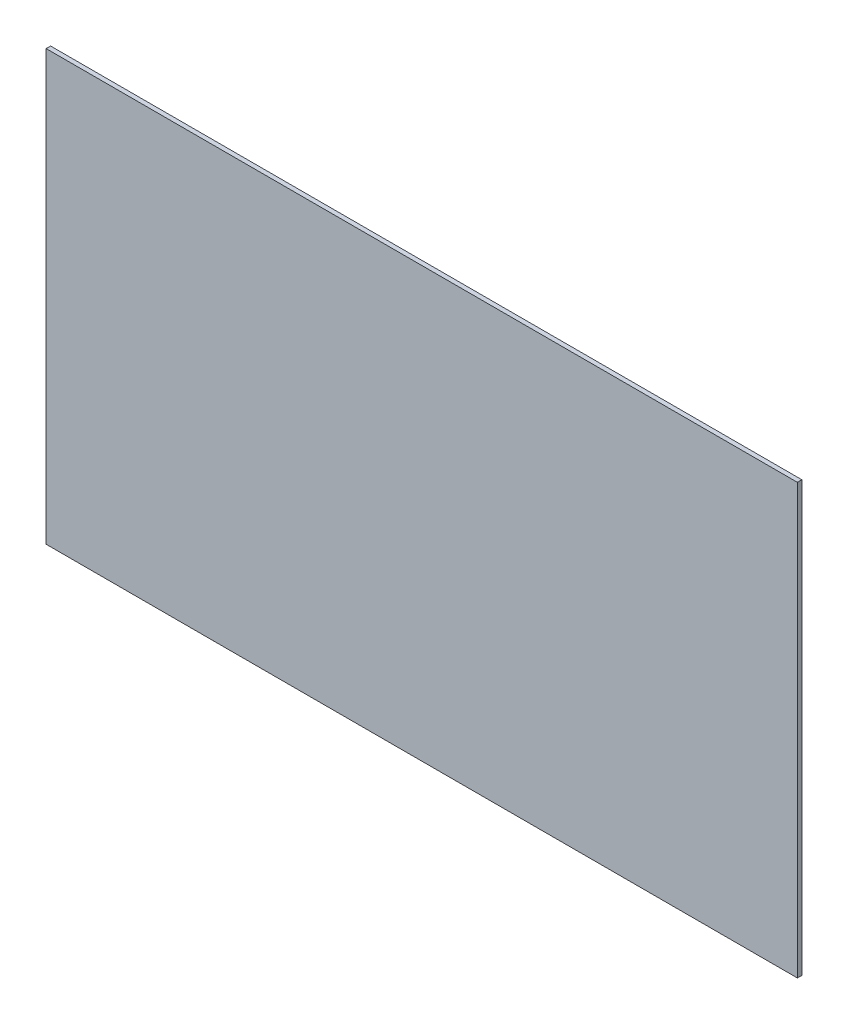
ISO-10303-21;
HEADER;
FILE_DESCRIPTION(('STEP AP214'),'2;1');
FILE_NAME('part.step','',(''),(''),'','','');
FILE_SCHEMA(('AUTOMOTIVE_DESIGN { 1 0 10303 214 1 1 1 1 }'));
ENDSEC;
DATA;
#1=APPLICATION_CONTEXT('core data for automotive mechanical design processes');
#2=APPLICATION_PROTOCOL_DEFINITION('international standard','automotive_design',2000,#1);
#3=PRODUCT_CONTEXT('',#1,'mechanical');
#4=PRODUCT('Part','Part','',(#3));
#5=PRODUCT_RELATED_PRODUCT_CATEGORY('part','',(#4));
#6=PRODUCT_DEFINITION_FORMATION('','',#4);
#7=PRODUCT_DEFINITION_CONTEXT('part definition',#1,'design');
#8=PRODUCT_DEFINITION('design','',#6,#7);
#9=PRODUCT_DEFINITION_SHAPE('','',#8);
#10=(LENGTH_UNIT() NAMED_UNIT(*) SI_UNIT(.MILLI.,.METRE.));
#11=(NAMED_UNIT(*) PLANE_ANGLE_UNIT() SI_UNIT($,.RADIAN.));
#12=(NAMED_UNIT(*) SI_UNIT($,.STERADIAN.) SOLID_ANGLE_UNIT());
#13=UNCERTAINTY_MEASURE_WITH_UNIT(LENGTH_MEASURE(1.E-05),#10,'distance_accuracy_value','');
#14=(GEOMETRIC_REPRESENTATION_CONTEXT(3) GLOBAL_UNCERTAINTY_ASSIGNED_CONTEXT((#13)) GLOBAL_UNIT_ASSIGNED_CONTEXT((#10,
#11,#12)) REPRESENTATION_CONTEXT('',''));
#15=CARTESIAN_POINT('',(0.,0.,0.));
#16=DIRECTION('',(0.,0.,1.));
#17=DIRECTION('',(1.,0.,0.));
#18=AXIS2_PLACEMENT_3D('',#15,#16,#17);
#19=CARTESIAN_POINT('',(0.,0.,3.17500000000001));
#20=DIRECTION('',(1.,0.,0.));
#21=DIRECTION('',(0.,0.,-1.));
#22=AXIS2_PLACEMENT_3D('',#19,#20,#21);
#23=PLANE('',#22);
#24=DIRECTION('',(0.,-1.,0.));
#25=VECTOR('',#24,1.);
#26=CARTESIAN_POINT('',(0.,0.,0.));
#27=LINE('',#26,#25);
#28=CARTESIAN_POINT('',(0.,304.8,0.));
#29=VERTEX_POINT('',#28);
#30=CARTESIAN_POINT('',(0.,0.,0.));
#31=VERTEX_POINT('',#30);
#32=EDGE_CURVE('E106',#29,#31,#27,.T.);
#33=ORIENTED_EDGE('',*,*,#32,.T.);
#34=DIRECTION('',(0.,0.,-1.));
#35=VECTOR('',#34,1.);
#36=CARTESIAN_POINT('',(0.,0.,3.17500000000001));
#37=LINE('',#36,#35);
#38=CARTESIAN_POINT('',(0.,0.,3.17500000000001));
#39=VERTEX_POINT('',#38);
#40=EDGE_CURVE('E11',#39,#31,#37,.T.);
#41=ORIENTED_EDGE('',*,*,#40,.F.);
#42=DIRECTION('',(0.,-1.,0.));
#43=VECTOR('',#42,1.);
#44=CARTESIAN_POINT('',(0.,0.,3.17500000000001));
#45=LINE('',#44,#43);
#46=CARTESIAN_POINT('',(0.,304.8,3.17500000000001));
#47=VERTEX_POINT('',#46);
#48=EDGE_CURVE('E90',#47,#39,#45,.T.);
#49=ORIENTED_EDGE('',*,*,#48,.F.);
#50=DIRECTION('',(0.,0.,-1.));
#51=VECTOR('',#50,1.);
#52=CARTESIAN_POINT('',(0.,304.8,3.17500000000001));
#53=LINE('',#52,#51);
#54=EDGE_CURVE('E102',#47,#29,#53,.T.);
#55=ORIENTED_EDGE('',*,*,#54,.T.);
#56=EDGE_LOOP('',(#33,#41,#49,#55));
#57=FACE_BOUND('',#56,.T.);
#58=ADVANCED_FACE('F38',(#57),#23,.F.);
#59=CARTESIAN_POINT('',(0.,0.,3.17500000000001));
#60=DIRECTION('',(0.,1.,0.));
#61=DIRECTION('',(0.,0.,1.));
#62=AXIS2_PLACEMENT_3D('',#59,#60,#61);
#63=PLANE('',#62);
#64=DIRECTION('',(1.,0.,0.));
#65=VECTOR('',#64,1.);
#66=CARTESIAN_POINT('',(0.,0.,0.));
#67=LINE('',#66,#65);
#68=CARTESIAN_POINT('',(533.4,-2.4980018054066E-12,0.));
#69=VERTEX_POINT('',#68);
#70=EDGE_CURVE('E95',#31,#69,#67,.T.);
#71=ORIENTED_EDGE('',*,*,#70,.T.);
#72=DIRECTION('',(0.,0.,-1.));
#73=VECTOR('',#72,1.);
#74=CARTESIAN_POINT('',(533.4,-2.4980018054066E-12,3.17500000000001));
#75=LINE('',#74,#73);
#76=CARTESIAN_POINT('',(533.4,-2.4980018054066E-12,3.17500000000001));
#77=VERTEX_POINT('',#76);
#78=EDGE_CURVE('E47',#77,#69,#75,.T.);
#79=ORIENTED_EDGE('',*,*,#78,.F.);
#80=DIRECTION('',(1.,0.,0.));
#81=VECTOR('',#80,1.);
#82=CARTESIAN_POINT('',(0.,0.,3.17500000000001));
#83=LINE('',#82,#81);
#84=EDGE_CURVE('E85',#39,#77,#83,.T.);
#85=ORIENTED_EDGE('',*,*,#84,.F.);
#86=ORIENTED_EDGE('',*,*,#40,.T.);
#87=EDGE_LOOP('',(#71,#79,#85,#86));
#88=FACE_BOUND('',#87,.T.);
#89=ADVANCED_FACE('F94',(#88),#63,.F.);
#90=CARTESIAN_POINT('',(533.4,-2.4980018054066E-12,3.17500000000001));
#91=DIRECTION('',(-1.,0.,0.));
#92=DIRECTION('',(0.,0.,1.));
#93=AXIS2_PLACEMENT_3D('',#90,#91,#92);
#94=PLANE('',#93);
#95=DIRECTION('',(0.,1.,0.));
#96=VECTOR('',#95,1.);
#97=CARTESIAN_POINT('',(533.4,-2.4980018054066E-12,0.));
#98=LINE('',#97,#96);
#99=CARTESIAN_POINT('',(533.4,304.8,0.));
#100=VERTEX_POINT('',#99);
#101=EDGE_CURVE('E72',#69,#100,#98,.T.);
#102=ORIENTED_EDGE('',*,*,#101,.T.);
#103=DIRECTION('',(0.,0.,-1.));
#104=VECTOR('',#103,1.);
#105=CARTESIAN_POINT('',(533.4,304.8,3.17500000000001));
#106=LINE('',#105,#104);
#107=CARTESIAN_POINT('',(533.4,304.8,3.17500000000001));
#108=VERTEX_POINT('',#107);
#109=EDGE_CURVE('E97',#108,#100,#106,.T.);
#110=ORIENTED_EDGE('',*,*,#109,.F.);
#111=DIRECTION('',(0.,1.,0.));
#112=VECTOR('',#111,1.);
#113=CARTESIAN_POINT('',(533.4,-2.4980018054066E-12,3.17500000000001));
#114=LINE('',#113,#112);
#115=EDGE_CURVE('E88',#77,#108,#114,.T.);
#116=ORIENTED_EDGE('',*,*,#115,.F.);
#117=ORIENTED_EDGE('',*,*,#78,.T.);
#118=EDGE_LOOP('',(#102,#110,#116,#117));
#119=FACE_BOUND('',#118,.T.);
#120=ADVANCED_FACE('F98',(#119),#94,.F.);
#121=CARTESIAN_POINT('',(0.,304.8,3.17500000000001));
#122=DIRECTION('',(0.,-1.,0.));
#123=DIRECTION('',(0.,0.,-1.));
#124=AXIS2_PLACEMENT_3D('',#121,#122,#123);
#125=PLANE('',#124);
#126=DIRECTION('',(-1.,0.,0.));
#127=VECTOR('',#126,1.);
#128=CARTESIAN_POINT('',(0.,304.8,0.));
#129=LINE('',#128,#127);
#130=EDGE_CURVE('E78',#100,#29,#129,.T.);
#131=ORIENTED_EDGE('',*,*,#130,.T.);
#132=ORIENTED_EDGE('',*,*,#54,.F.);
#133=DIRECTION('',(-1.,0.,0.));
#134=VECTOR('',#133,1.);
#135=CARTESIAN_POINT('',(0.,304.8,3.17500000000001));
#136=LINE('',#135,#134);
#137=EDGE_CURVE('E55',#108,#47,#136,.T.);
#138=ORIENTED_EDGE('',*,*,#137,.F.);
#139=ORIENTED_EDGE('',*,*,#109,.T.);
#140=EDGE_LOOP('',(#131,#132,#138,#139));
#141=FACE_BOUND('',#140,.T.);
#142=ADVANCED_FACE('F119',(#141),#125,.F.);
#143=CARTESIAN_POINT('',(0.,0.,3.17500000000001));
#144=DIRECTION('',(0.,0.,-1.));
#145=DIRECTION('',(-1.,0.,0.));
#146=AXIS2_PLACEMENT_3D('',#143,#144,#145);
#147=PLANE('',#146);
#148=ORIENTED_EDGE('',*,*,#48,.T.);
#149=ORIENTED_EDGE('',*,*,#84,.T.);
#150=ORIENTED_EDGE('',*,*,#115,.T.);
#151=ORIENTED_EDGE('',*,*,#137,.T.);
#152=EDGE_LOOP('',(#148,#149,#150,#151));
#153=FACE_BOUND('',#152,.T.);
#154=ADVANCED_FACE('F86',(#153),#147,.F.);
#155=CARTESIAN_POINT('',(0.,0.,0.));
#156=DIRECTION('',(0.,0.,-1.));
#157=DIRECTION('',(-1.,0.,0.));
#158=AXIS2_PLACEMENT_3D('',#155,#156,#157);
#159=PLANE('',#158);
#160=ORIENTED_EDGE('',*,*,#32,.F.);
#161=ORIENTED_EDGE('',*,*,#130,.F.);
#162=ORIENTED_EDGE('',*,*,#101,.F.);
#163=ORIENTED_EDGE('',*,*,#70,.F.);
#164=EDGE_LOOP('',(#160,#161,#162,#163));
#165=FACE_BOUND('',#164,.T.);
#166=ADVANCED_FACE('F122',(#165),#159,.T.);
#167=CLOSED_SHELL('',(#58,#89,#120,#142,#154,#166));
#168=MANIFOLD_SOLID_BREP('B2',#167);
#169=ADVANCED_BREP_SHAPE_REPRESENTATION('',(#18,#168),#14);
#170=SHAPE_DEFINITION_REPRESENTATION(#9,#169);
ENDSEC;
END-ISO-10303-21;
